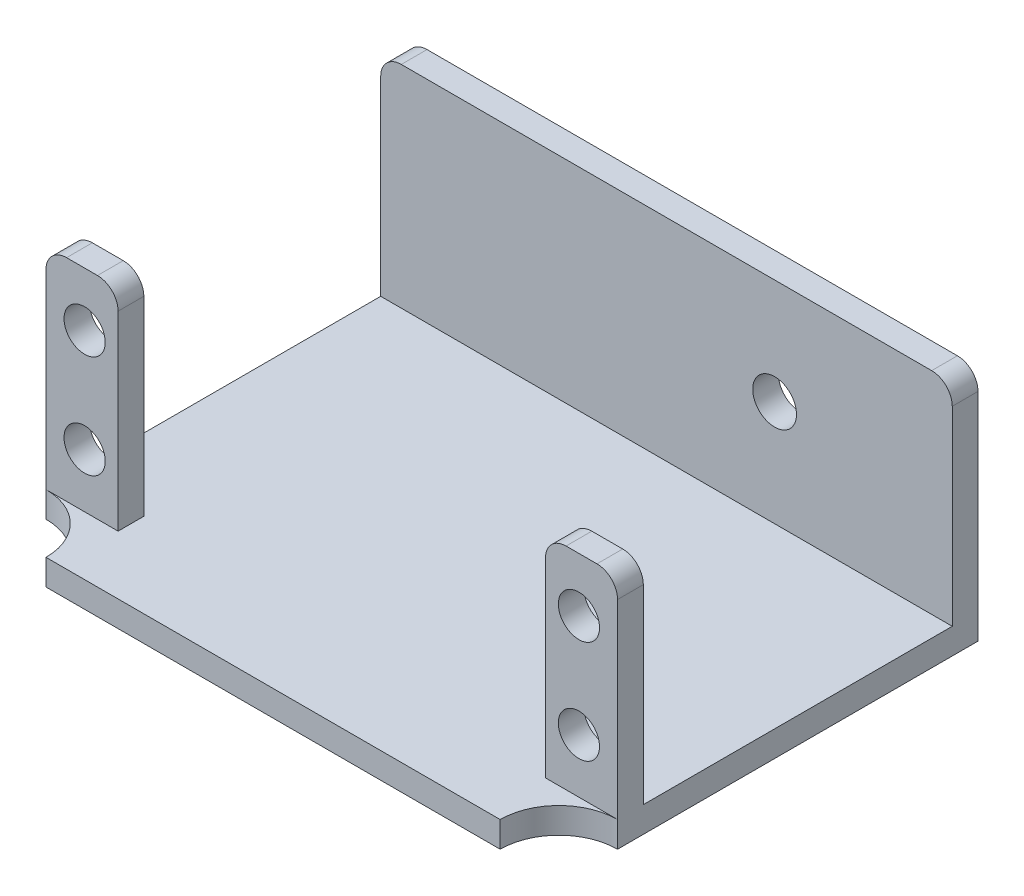
ISO-10303-21;
HEADER;
FILE_DESCRIPTION(('STEP AP214'),'2;1');
FILE_NAME('part.step','',(''),(''),'','','');
FILE_SCHEMA(('AUTOMOTIVE_DESIGN { 1 0 10303 214 1 1 1 1 }'));
ENDSEC;
DATA;
#1=APPLICATION_CONTEXT('core data for automotive mechanical design processes');
#2=APPLICATION_PROTOCOL_DEFINITION('international standard','automotive_design',2000,#1);
#3=PRODUCT_CONTEXT('',#1,'mechanical');
#4=PRODUCT('Part','Part','',(#3));
#5=PRODUCT_RELATED_PRODUCT_CATEGORY('part','',(#4));
#6=PRODUCT_DEFINITION_FORMATION('','',#4);
#7=PRODUCT_DEFINITION_CONTEXT('part definition',#1,'design');
#8=PRODUCT_DEFINITION('design','',#6,#7);
#9=PRODUCT_DEFINITION_SHAPE('','',#8);
#10=(LENGTH_UNIT() NAMED_UNIT(*) SI_UNIT(.MILLI.,.METRE.));
#11=(NAMED_UNIT(*) PLANE_ANGLE_UNIT() SI_UNIT($,.RADIAN.));
#12=(NAMED_UNIT(*) SI_UNIT($,.STERADIAN.) SOLID_ANGLE_UNIT());
#13=UNCERTAINTY_MEASURE_WITH_UNIT(LENGTH_MEASURE(1.E-05),#10,'distance_accuracy_value','');
#14=(GEOMETRIC_REPRESENTATION_CONTEXT(3) GLOBAL_UNCERTAINTY_ASSIGNED_CONTEXT((#13)) GLOBAL_UNIT_ASSIGNED_CONTEXT((#10,
#11,#12)) REPRESENTATION_CONTEXT('',''));
#15=CARTESIAN_POINT('',(0.,0.,0.));
#16=DIRECTION('',(0.,0.,1.));
#17=DIRECTION('',(1.,0.,0.));
#18=AXIS2_PLACEMENT_3D('',#15,#16,#17);
#19=CARTESIAN_POINT('',(0.,2.5,0.));
#20=DIRECTION('',(1.,0.,0.));
#21=DIRECTION('',(0.,0.,-1.));
#22=AXIS2_PLACEMENT_3D('',#19,#20,#21);
#23=PLANE('',#22);
#24=DIRECTION('',(0.,-1.,0.));
#25=VECTOR('',#24,1.);
#26=CARTESIAN_POINT('',(0.,2.5,-5.7));
#27=LINE('',#26,#25);
#28=CARTESIAN_POINT('',(0.,21.,-5.7));
#29=VERTEX_POINT('',#28);
#30=CARTESIAN_POINT('',(0.,2.5,-5.7));
#31=VERTEX_POINT('',#30);
#32=EDGE_CURVE('E255',#29,#31,#27,.T.);
#33=ORIENTED_EDGE('',*,*,#32,.F.);
#34=DIRECTION('',(0.,0.,-1.));
#35=VECTOR('',#34,1.);
#36=CARTESIAN_POINT('',(0.,21.,0.));
#37=LINE('',#36,#35);
#38=CARTESIAN_POINT('',(0.,21.,-8.2));
#39=VERTEX_POINT('',#38);
#40=EDGE_CURVE('E361',#29,#39,#37,.T.);
#41=ORIENTED_EDGE('',*,*,#40,.T.);
#42=DIRECTION('',(0.,-1.,0.));
#43=VECTOR('',#42,1.);
#44=CARTESIAN_POINT('',(0.,2.5,-8.2));
#45=LINE('',#44,#43);
#46=CARTESIAN_POINT('',(0.,2.5,-8.2));
#47=VERTEX_POINT('',#46);
#48=EDGE_CURVE('E254',#39,#47,#45,.T.);
#49=ORIENTED_EDGE('',*,*,#48,.T.);
#50=DIRECTION('',(0.,0.,1.));
#51=VECTOR('',#50,1.);
#52=CARTESIAN_POINT('',(0.,2.5,0.));
#53=LINE('',#52,#51);
#54=CARTESIAN_POINT('',(0.,2.5,-38.2));
#55=VERTEX_POINT('',#54);
#56=EDGE_CURVE('E288',#55,#47,#53,.T.);
#57=ORIENTED_EDGE('',*,*,#56,.F.);
#58=DIRECTION('',(0.,-1.,0.));
#59=VECTOR('',#58,1.);
#60=CARTESIAN_POINT('',(0.,78.5562777730834,-38.2));
#61=LINE('',#60,#59);
#62=CARTESIAN_POINT('',(0.,21.,-38.2));
#63=VERTEX_POINT('',#62);
#64=EDGE_CURVE('E402',#63,#55,#61,.T.);
#65=ORIENTED_EDGE('',*,*,#64,.F.);
#66=DIRECTION('',(0.,0.,-1.));
#67=VECTOR('',#66,1.);
#68=CARTESIAN_POINT('',(0.,21.,0.));
#69=LINE('',#68,#67);
#70=CARTESIAN_POINT('',(0.,21.,-40.7));
#71=VERTEX_POINT('',#70);
#72=EDGE_CURVE('E357',#63,#71,#69,.T.);
#73=ORIENTED_EDGE('',*,*,#72,.T.);
#74=DIRECTION('',(0.,-1.,0.));
#75=VECTOR('',#74,1.);
#76=CARTESIAN_POINT('',(0.,78.5562777730834,-40.7));
#77=LINE('',#76,#75);
#78=CARTESIAN_POINT('',(0.,0.,-40.7));
#79=VERTEX_POINT('',#78);
#80=EDGE_CURVE('E399',#71,#79,#77,.T.);
#81=ORIENTED_EDGE('',*,*,#80,.T.);
#82=DIRECTION('',(0.,0.,1.));
#83=VECTOR('',#82,1.);
#84=CARTESIAN_POINT('',(0.,0.,0.));
#85=LINE('',#84,#83);
#86=CARTESIAN_POINT('',(0.,0.,-5.7));
#87=VERTEX_POINT('',#86);
#88=EDGE_CURVE('E287',#79,#87,#85,.T.);
#89=ORIENTED_EDGE('',*,*,#88,.T.);
#90=DIRECTION('',(0.,1.,0.));
#91=VECTOR('',#90,1.);
#92=CARTESIAN_POINT('',(0.,0.,-5.7));
#93=LINE('',#92,#91);
#94=EDGE_CURVE('E482',#87,#31,#93,.T.);
#95=ORIENTED_EDGE('',*,*,#94,.T.);
#96=EDGE_LOOP('',(#33,#41,#49,#57,#65,#73,#81,#89,#95));
#97=FACE_BOUND('',#96,.T.);
#98=ADVANCED_FACE('F41',(#97),#23,.F.);
#99=CARTESIAN_POINT('',(0.,2.5,0.));
#100=DIRECTION('',(0.,0.,-1.));
#101=DIRECTION('',(-1.,0.,0.));
#102=AXIS2_PLACEMENT_3D('',#99,#100,#101);
#103=PLANE('',#102);
#104=DIRECTION('',(1.,0.,0.));
#105=VECTOR('',#104,1.);
#106=CARTESIAN_POINT('',(0.,2.5,0.));
#107=LINE('',#106,#105);
#108=CARTESIAN_POINT('',(5.7,2.5,0.));
#109=VERTEX_POINT('',#108);
#110=CARTESIAN_POINT('',(49.8,2.5,0.));
#111=VERTEX_POINT('',#110);
#112=EDGE_CURVE('E209',#109,#111,#107,.T.);
#113=ORIENTED_EDGE('',*,*,#112,.F.);
#114=DIRECTION('',(0.,1.,0.));
#115=VECTOR('',#114,1.);
#116=CARTESIAN_POINT('',(5.7,0.,0.));
#117=LINE('',#116,#115);
#118=CARTESIAN_POINT('',(5.7,0.,0.));
#119=VERTEX_POINT('',#118);
#120=EDGE_CURVE('E489',#109,#119,#117,.F.);
#121=ORIENTED_EDGE('',*,*,#120,.T.);
#122=DIRECTION('',(1.,0.,0.));
#123=VECTOR('',#122,1.);
#124=CARTESIAN_POINT('',(0.,0.,0.));
#125=LINE('',#124,#123);
#126=CARTESIAN_POINT('',(49.8,0.,0.));
#127=VERTEX_POINT('',#126);
#128=EDGE_CURVE('E307',#119,#127,#125,.T.);
#129=ORIENTED_EDGE('',*,*,#128,.T.);
#130=DIRECTION('',(0.,1.,0.));
#131=VECTOR('',#130,1.);
#132=CARTESIAN_POINT('',(49.8,0.,0.));
#133=LINE('',#132,#131);
#134=EDGE_CURVE('E195',#127,#111,#133,.T.);
#135=ORIENTED_EDGE('',*,*,#134,.T.);
#136=EDGE_LOOP('',(#113,#121,#129,#135));
#137=FACE_BOUND('',#136,.T.);
#138=ADVANCED_FACE('F525',(#137),#103,.F.);
#139=CARTESIAN_POINT('',(55.5,2.5,0.));
#140=DIRECTION('',(-1.,0.,0.));
#141=DIRECTION('',(0.,0.,1.));
#142=AXIS2_PLACEMENT_3D('',#139,#140,#141);
#143=PLANE('',#142);
#144=DIRECTION('',(0.,1.,0.));
#145=VECTOR('',#144,1.);
#146=CARTESIAN_POINT('',(55.5,2.5,-8.2));
#147=LINE('',#146,#145);
#148=CARTESIAN_POINT('',(55.5,2.5,-8.2));
#149=VERTEX_POINT('',#148);
#150=CARTESIAN_POINT('',(55.5,21.,-8.2));
#151=VERTEX_POINT('',#150);
#152=EDGE_CURVE('E242',#149,#151,#147,.T.);
#153=ORIENTED_EDGE('',*,*,#152,.T.);
#154=DIRECTION('',(0.,0.,-1.));
#155=VECTOR('',#154,1.);
#156=CARTESIAN_POINT('',(55.5,21.,0.));
#157=LINE('',#156,#155);
#158=CARTESIAN_POINT('',(55.5,21.,-5.7));
#159=VERTEX_POINT('',#158);
#160=EDGE_CURVE('E226',#151,#159,#157,.F.);
#161=ORIENTED_EDGE('',*,*,#160,.T.);
#162=DIRECTION('',(0.,1.,0.));
#163=VECTOR('',#162,1.);
#164=CARTESIAN_POINT('',(55.5,2.5,-5.7));
#165=LINE('',#164,#163);
#166=CARTESIAN_POINT('',(55.5,2.5,-5.7));
#167=VERTEX_POINT('',#166);
#168=EDGE_CURVE('E216',#167,#159,#165,.T.);
#169=ORIENTED_EDGE('',*,*,#168,.F.);
#170=DIRECTION('',(0.,1.,0.));
#171=VECTOR('',#170,1.);
#172=CARTESIAN_POINT('',(55.5,0.,-5.7));
#173=LINE('',#172,#171);
#174=CARTESIAN_POINT('',(55.5,0.,-5.7));
#175=VERTEX_POINT('',#174);
#176=EDGE_CURVE('E183',#167,#175,#173,.F.);
#177=ORIENTED_EDGE('',*,*,#176,.T.);
#178=DIRECTION('',(0.,0.,-1.));
#179=VECTOR('',#178,1.);
#180=CARTESIAN_POINT('',(55.5,0.,0.));
#181=LINE('',#180,#179);
#182=CARTESIAN_POINT('',(55.5,0.,-40.7));
#183=VERTEX_POINT('',#182);
#184=EDGE_CURVE('E292',#175,#183,#181,.T.);
#185=ORIENTED_EDGE('',*,*,#184,.T.);
#186=DIRECTION('',(0.,-1.,0.));
#187=VECTOR('',#186,1.);
#188=CARTESIAN_POINT('',(55.5,78.5562777730834,-40.7));
#189=LINE('',#188,#187);
#190=CARTESIAN_POINT('',(55.5,21.,-40.7));
#191=VERTEX_POINT('',#190);
#192=EDGE_CURVE('E408',#191,#183,#189,.T.);
#193=ORIENTED_EDGE('',*,*,#192,.F.);
#194=DIRECTION('',(0.,0.,1.));
#195=VECTOR('',#194,1.);
#196=CARTESIAN_POINT('',(55.5,21.,0.));
#197=LINE('',#196,#195);
#198=CARTESIAN_POINT('',(55.5,21.,-38.2));
#199=VERTEX_POINT('',#198);
#200=EDGE_CURVE('E365',#191,#199,#197,.T.);
#201=ORIENTED_EDGE('',*,*,#200,.T.);
#202=DIRECTION('',(0.,-1.,0.));
#203=VECTOR('',#202,1.);
#204=CARTESIAN_POINT('',(55.5,78.5562777730834,-38.2));
#205=LINE('',#204,#203);
#206=CARTESIAN_POINT('',(55.5,2.5,-38.2));
#207=VERTEX_POINT('',#206);
#208=EDGE_CURVE('E412',#199,#207,#205,.T.);
#209=ORIENTED_EDGE('',*,*,#208,.T.);
#210=DIRECTION('',(0.,0.,-1.));
#211=VECTOR('',#210,1.);
#212=CARTESIAN_POINT('',(55.5,2.5,0.));
#213=LINE('',#212,#211);
#214=EDGE_CURVE('E295',#149,#207,#213,.T.);
#215=ORIENTED_EDGE('',*,*,#214,.F.);
#216=EDGE_LOOP('',(#153,#161,#169,#177,#185,#193,#201,#209,#215));
#217=FACE_BOUND('',#216,.T.);
#218=ADVANCED_FACE('F224',(#217),#143,.F.);
#219=CARTESIAN_POINT('',(0.,2.5,0.));
#220=DIRECTION('',(0.,-1.,0.));
#221=DIRECTION('',(0.,0.,-1.));
#222=AXIS2_PLACEMENT_3D('',#219,#220,#221);
#223=PLANE('',#222);
#224=DIRECTION('',(1.,0.,0.));
#225=VECTOR('',#224,1.);
#226=CARTESIAN_POINT('',(0.,2.5,-5.7));
#227=LINE('',#226,#225);
#228=CARTESIAN_POINT('',(7.,2.5,-5.7));
#229=VERTEX_POINT('',#228);
#230=EDGE_CURVE('E258',#31,#229,#227,.T.);
#231=ORIENTED_EDGE('',*,*,#230,.F.);
#232=CARTESIAN_POINT('',(0.,2.5,0.));
#233=DIRECTION('',(0.,1.,0.));
#234=DIRECTION('',(0.,0.,1.));
#235=AXIS2_PLACEMENT_3D('',#232,#233,#234);
#236=CIRCLE('',#235,5.7);
#237=EDGE_CURVE('E485',#109,#31,#236,.T.);
#238=ORIENTED_EDGE('',*,*,#237,.F.);
#239=ORIENTED_EDGE('',*,*,#112,.T.);
#240=CARTESIAN_POINT('',(55.5,2.5,0.));
#241=DIRECTION('',(0.,1.,0.));
#242=DIRECTION('',(0.,0.,1.));
#243=AXIS2_PLACEMENT_3D('',#240,#241,#242);
#244=CIRCLE('',#243,5.7);
#245=EDGE_CURVE('E186',#167,#111,#244,.T.);
#246=ORIENTED_EDGE('',*,*,#245,.F.);
#247=DIRECTION('',(1.,0.,0.));
#248=VECTOR('',#247,1.);
#249=CARTESIAN_POINT('',(55.5,2.5,-5.7));
#250=LINE('',#249,#248);
#251=CARTESIAN_POINT('',(48.5,2.5,-5.7));
#252=VERTEX_POINT('',#251);
#253=EDGE_CURVE('E205',#252,#167,#250,.T.);
#254=ORIENTED_EDGE('',*,*,#253,.F.);
#255=DIRECTION('',(0.,0.,-1.));
#256=VECTOR('',#255,1.);
#257=CARTESIAN_POINT('',(48.5,2.5,-5.7));
#258=LINE('',#257,#256);
#259=CARTESIAN_POINT('',(48.5,2.5,-8.2));
#260=VERTEX_POINT('',#259);
#261=EDGE_CURVE('E221',#252,#260,#258,.T.);
#262=ORIENTED_EDGE('',*,*,#261,.T.);
#263=DIRECTION('',(1.,0.,0.));
#264=VECTOR('',#263,1.);
#265=CARTESIAN_POINT('',(55.5,2.5,-8.2));
#266=LINE('',#265,#264);
#267=EDGE_CURVE('E229',#260,#149,#266,.T.);
#268=ORIENTED_EDGE('',*,*,#267,.T.);
#269=ORIENTED_EDGE('',*,*,#214,.T.);
#270=DIRECTION('',(-1.,0.,0.));
#271=VECTOR('',#270,1.);
#272=CARTESIAN_POINT('',(0.,2.5,-38.2));
#273=LINE('',#272,#271);
#274=EDGE_CURVE('E299',#207,#55,#273,.T.);
#275=ORIENTED_EDGE('',*,*,#274,.T.);
#276=ORIENTED_EDGE('',*,*,#56,.T.);
#277=DIRECTION('',(1.,0.,0.));
#278=VECTOR('',#277,1.);
#279=CARTESIAN_POINT('',(0.,2.5,-8.2));
#280=LINE('',#279,#278);
#281=CARTESIAN_POINT('',(7.,2.5,-8.2));
#282=VERTEX_POINT('',#281);
#283=EDGE_CURVE('E274',#47,#282,#280,.T.);
#284=ORIENTED_EDGE('',*,*,#283,.T.);
#285=DIRECTION('',(0.,0.,-1.));
#286=VECTOR('',#285,1.);
#287=CARTESIAN_POINT('',(7.,2.5,-5.7));
#288=LINE('',#287,#286);
#289=EDGE_CURVE('E271',#229,#282,#288,.T.);
#290=ORIENTED_EDGE('',*,*,#289,.F.);
#291=EDGE_LOOP('',(#231,#238,#239,#246,#254,#262,#268,#269,#275,#276,#284,#290));
#292=FACE_BOUND('',#291,.T.);
#293=ADVANCED_FACE('F203',(#292),#223,.F.);
#294=CARTESIAN_POINT('',(0.,0.,0.));
#295=DIRECTION('',(0.,-1.,0.));
#296=DIRECTION('',(0.,0.,-1.));
#297=AXIS2_PLACEMENT_3D('',#294,#295,#296);
#298=PLANE('',#297);
#299=CARTESIAN_POINT('',(0.,0.,0.));
#300=DIRECTION('',(0.,1.,0.));
#301=DIRECTION('',(0.,0.,1.));
#302=AXIS2_PLACEMENT_3D('',#299,#300,#301);
#303=CIRCLE('',#302,5.7);
#304=EDGE_CURVE('E196',#119,#87,#303,.T.);
#305=ORIENTED_EDGE('',*,*,#304,.T.);
#306=ORIENTED_EDGE('',*,*,#88,.F.);
#307=DIRECTION('',(-1.,0.,0.));
#308=VECTOR('',#307,1.);
#309=CARTESIAN_POINT('',(0.,0.,-40.7));
#310=LINE('',#309,#308);
#311=EDGE_CURVE('E406',#183,#79,#310,.T.);
#312=ORIENTED_EDGE('',*,*,#311,.F.);
#313=ORIENTED_EDGE('',*,*,#184,.F.);
#314=CARTESIAN_POINT('',(55.5,0.,0.));
#315=DIRECTION('',(0.,1.,0.));
#316=DIRECTION('',(0.,0.,1.));
#317=AXIS2_PLACEMENT_3D('',#314,#315,#316);
#318=CIRCLE('',#317,5.7);
#319=EDGE_CURVE('E189',#175,#127,#318,.T.);
#320=ORIENTED_EDGE('',*,*,#319,.T.);
#321=ORIENTED_EDGE('',*,*,#128,.F.);
#322=EDGE_LOOP('',(#305,#306,#312,#313,#320,#321));
#323=FACE_BOUND('',#322,.T.);
#324=ADVANCED_FACE('F555',(#323),#298,.T.);
#325=CARTESIAN_POINT('',(7.,2.5,-5.7));
#326=DIRECTION('',(-1.,0.,0.));
#327=DIRECTION('',(0.,0.,1.));
#328=AXIS2_PLACEMENT_3D('',#325,#326,#327);
#329=PLANE('',#328);
#330=DIRECTION('',(0.,1.,0.));
#331=VECTOR('',#330,1.);
#332=CARTESIAN_POINT('',(7.,2.5,-8.2));
#333=LINE('',#332,#331);
#334=CARTESIAN_POINT('',(7.,21.,-8.2));
#335=VERTEX_POINT('',#334);
#336=EDGE_CURVE('E277',#282,#335,#333,.T.);
#337=ORIENTED_EDGE('',*,*,#336,.T.);
#338=DIRECTION('',(0.,0.,-1.));
#339=VECTOR('',#338,1.);
#340=CARTESIAN_POINT('',(7.,21.,-5.7));
#341=LINE('',#340,#339);
#342=CARTESIAN_POINT('',(7.,21.,-5.7));
#343=VERTEX_POINT('',#342);
#344=EDGE_CURVE('E325',#335,#343,#341,.F.);
#345=ORIENTED_EDGE('',*,*,#344,.T.);
#346=DIRECTION('',(0.,1.,0.));
#347=VECTOR('',#346,1.);
#348=CARTESIAN_POINT('',(7.,2.5,-5.7));
#349=LINE('',#348,#347);
#350=EDGE_CURVE('E263',#229,#343,#349,.T.);
#351=ORIENTED_EDGE('',*,*,#350,.F.);
#352=ORIENTED_EDGE('',*,*,#289,.T.);
#353=EDGE_LOOP('',(#337,#345,#351,#352));
#354=FACE_BOUND('',#353,.T.);
#355=ADVANCED_FACE('F558',(#354),#329,.F.);
#356=CARTESIAN_POINT('',(0.,23.,-5.7));
#357=DIRECTION('',(0.,-1.,0.));
#358=DIRECTION('',(0.,0.,-1.));
#359=AXIS2_PLACEMENT_3D('',#356,#357,#358);
#360=PLANE('',#359);
#361=DIRECTION('',(-1.,0.,0.));
#362=VECTOR('',#361,1.);
#363=CARTESIAN_POINT('',(0.,23.,-5.7));
#364=LINE('',#363,#362);
#365=CARTESIAN_POINT('',(5.,23.,-5.7));
#366=VERTEX_POINT('',#365);
#367=CARTESIAN_POINT('',(2.,23.,-5.7));
#368=VERTEX_POINT('',#367);
#369=EDGE_CURVE('E267',#366,#368,#364,.T.);
#370=ORIENTED_EDGE('',*,*,#369,.F.);
#371=DIRECTION('',(0.,0.,-1.));
#372=VECTOR('',#371,1.);
#373=CARTESIAN_POINT('',(5.,23.,-5.7));
#374=LINE('',#373,#372);
#375=CARTESIAN_POINT('',(5.,23.,-8.2));
#376=VERTEX_POINT('',#375);
#377=EDGE_CURVE('E315',#366,#376,#374,.T.);
#378=ORIENTED_EDGE('',*,*,#377,.T.);
#379=DIRECTION('',(-1.,0.,0.));
#380=VECTOR('',#379,1.);
#381=CARTESIAN_POINT('',(0.,23.,-8.2));
#382=LINE('',#381,#380);
#383=CARTESIAN_POINT('',(2.,23.,-8.2));
#384=VERTEX_POINT('',#383);
#385=EDGE_CURVE('E259',#376,#384,#382,.T.);
#386=ORIENTED_EDGE('',*,*,#385,.T.);
#387=DIRECTION('',(0.,0.,-1.));
#388=VECTOR('',#387,1.);
#389=CARTESIAN_POINT('',(2.,23.,-5.7));
#390=LINE('',#389,#388);
#391=EDGE_CURVE('E303',#384,#368,#390,.F.);
#392=ORIENTED_EDGE('',*,*,#391,.T.);
#393=EDGE_LOOP('',(#370,#378,#386,#392));
#394=FACE_BOUND('',#393,.T.);
#395=ADVANCED_FACE('F459',(#394),#360,.F.);
#396=CARTESIAN_POINT('',(0.,0.,-5.7));
#397=DIRECTION('',(0.,0.,-1.));
#398=DIRECTION('',(-1.,0.,0.));
#399=AXIS2_PLACEMENT_3D('',#396,#397,#398);
#400=PLANE('',#399);
#401=CARTESIAN_POINT('',(3.75,7.75,-5.7));
#402=DIRECTION('',(0.,0.,1.));
#403=DIRECTION('',(-1.,0.,0.));
#404=AXIS2_PLACEMENT_3D('',#401,#402,#403);
#405=CIRCLE('',#404,2.);
#406=CARTESIAN_POINT('',(1.75,7.75,-5.7));
#407=VERTEX_POINT('',#406);
#408=EDGE_CURVE('E427',#407,#407,#405,.T.);
#409=ORIENTED_EDGE('',*,*,#408,.F.);
#410=EDGE_LOOP('',(#409));
#411=FACE_BOUND('',#410,.T.);
#412=CARTESIAN_POINT('',(3.75,17.75,-5.7));
#413=DIRECTION('',(0.,0.,1.));
#414=DIRECTION('',(1.,0.,0.));
#415=AXIS2_PLACEMENT_3D('',#412,#413,#414);
#416=CIRCLE('',#415,2.);
#417=CARTESIAN_POINT('',(5.75,17.75,-5.7));
#418=VERTEX_POINT('',#417);
#419=EDGE_CURVE('E237',#418,#418,#416,.T.);
#420=ORIENTED_EDGE('',*,*,#419,.F.);
#421=EDGE_LOOP('',(#420));
#422=FACE_BOUND('',#421,.T.);
#423=ORIENTED_EDGE('',*,*,#350,.T.);
#424=CARTESIAN_POINT('',(5.,21.,-5.7));
#425=DIRECTION('',(0.,0.,-1.));
#426=DIRECTION('',(-1.,0.,0.));
#427=AXIS2_PLACEMENT_3D('',#424,#425,#426);
#428=CIRCLE('',#427,2.);
#429=EDGE_CURVE('E331',#343,#366,#428,.F.);
#430=ORIENTED_EDGE('',*,*,#429,.T.);
#431=ORIENTED_EDGE('',*,*,#369,.T.);
#432=CARTESIAN_POINT('',(2.,21.,-5.7));
#433=DIRECTION('',(0.,0.,-1.));
#434=DIRECTION('',(-1.,0.,0.));
#435=AXIS2_PLACEMENT_3D('',#432,#433,#434);
#436=CIRCLE('',#435,2.);
#437=EDGE_CURVE('E328',#368,#29,#436,.F.);
#438=ORIENTED_EDGE('',*,*,#437,.T.);
#439=ORIENTED_EDGE('',*,*,#32,.T.);
#440=ORIENTED_EDGE('',*,*,#230,.T.);
#441=EDGE_LOOP('',(#423,#430,#431,#438,#439,#440));
#442=FACE_BOUND('',#441,.T.);
#443=ADVANCED_FACE('F455',(#411,#422,#442),#400,.F.);
#444=CARTESIAN_POINT('',(0.,0.,-8.2));
#445=DIRECTION('',(0.,0.,-1.));
#446=DIRECTION('',(-1.,0.,0.));
#447=AXIS2_PLACEMENT_3D('',#444,#445,#446);
#448=PLANE('',#447);
#449=CARTESIAN_POINT('',(3.75,7.75,-8.2));
#450=DIRECTION('',(0.,0.,1.));
#451=DIRECTION('',(-1.,0.,0.));
#452=AXIS2_PLACEMENT_3D('',#449,#450,#451);
#453=CIRCLE('',#452,2.);
#454=CARTESIAN_POINT('',(1.75,7.75,-8.2));
#455=VERTEX_POINT('',#454);
#456=EDGE_CURVE('E423',#455,#455,#453,.T.);
#457=ORIENTED_EDGE('',*,*,#456,.T.);
#458=EDGE_LOOP('',(#457));
#459=FACE_BOUND('',#458,.T.);
#460=CARTESIAN_POINT('',(3.75,17.75,-8.2));
#461=DIRECTION('',(0.,0.,1.));
#462=DIRECTION('',(1.,0.,0.));
#463=AXIS2_PLACEMENT_3D('',#460,#461,#462);
#464=CIRCLE('',#463,2.);
#465=CARTESIAN_POINT('',(5.75,17.75,-8.2));
#466=VERTEX_POINT('',#465);
#467=EDGE_CURVE('E246',#466,#466,#464,.T.);
#468=ORIENTED_EDGE('',*,*,#467,.T.);
#469=EDGE_LOOP('',(#468));
#470=FACE_BOUND('',#469,.T.);
#471=ORIENTED_EDGE('',*,*,#385,.F.);
#472=CARTESIAN_POINT('',(5.,21.,-8.2));
#473=DIRECTION('',(0.,0.,-1.));
#474=DIRECTION('',(-1.,0.,0.));
#475=AXIS2_PLACEMENT_3D('',#472,#473,#474);
#476=CIRCLE('',#475,2.);
#477=EDGE_CURVE('E322',#376,#335,#476,.T.);
#478=ORIENTED_EDGE('',*,*,#477,.T.);
#479=ORIENTED_EDGE('',*,*,#336,.F.);
#480=ORIENTED_EDGE('',*,*,#283,.F.);
#481=ORIENTED_EDGE('',*,*,#48,.F.);
#482=CARTESIAN_POINT('',(2.,21.,-8.2));
#483=DIRECTION('',(0.,0.,-1.));
#484=DIRECTION('',(-1.,0.,0.));
#485=AXIS2_PLACEMENT_3D('',#482,#483,#484);
#486=CIRCLE('',#485,2.);
#487=EDGE_CURVE('E319',#39,#384,#486,.T.);
#488=ORIENTED_EDGE('',*,*,#487,.T.);
#489=EDGE_LOOP('',(#471,#478,#479,#480,#481,#488));
#490=FACE_BOUND('',#489,.T.);
#491=ADVANCED_FACE('F458',(#459,#470,#490),#448,.T.);
#492=CARTESIAN_POINT('',(55.5,23.,-5.7));
#493=DIRECTION('',(0.,-1.,0.));
#494=DIRECTION('',(0.,0.,-1.));
#495=AXIS2_PLACEMENT_3D('',#492,#493,#494);
#496=PLANE('',#495);
#497=DIRECTION('',(-1.,0.,0.));
#498=VECTOR('',#497,1.);
#499=CARTESIAN_POINT('',(55.5,23.,-8.2));
#500=LINE('',#499,#498);
#501=CARTESIAN_POINT('',(53.5,23.,-8.2));
#502=VERTEX_POINT('',#501);
#503=CARTESIAN_POINT('',(50.5,23.,-8.2));
#504=VERTEX_POINT('',#503);
#505=EDGE_CURVE('E245',#502,#504,#500,.T.);
#506=ORIENTED_EDGE('',*,*,#505,.T.);
#507=DIRECTION('',(0.,0.,-1.));
#508=VECTOR('',#507,1.);
#509=CARTESIAN_POINT('',(50.5,23.,-5.7));
#510=LINE('',#509,#508);
#511=CARTESIAN_POINT('',(50.5,23.,-5.7));
#512=VERTEX_POINT('',#511);
#513=EDGE_CURVE('E348',#504,#512,#510,.F.);
#514=ORIENTED_EDGE('',*,*,#513,.T.);
#515=DIRECTION('',(-1.,0.,0.));
#516=VECTOR('',#515,1.);
#517=CARTESIAN_POINT('',(55.5,23.,-5.7));
#518=LINE('',#517,#516);
#519=CARTESIAN_POINT('',(53.5,23.,-5.7));
#520=VERTEX_POINT('',#519);
#521=EDGE_CURVE('E228',#520,#512,#518,.T.);
#522=ORIENTED_EDGE('',*,*,#521,.F.);
#523=DIRECTION('',(0.,0.,-1.));
#524=VECTOR('',#523,1.);
#525=CARTESIAN_POINT('',(53.5,23.,-5.7));
#526=LINE('',#525,#524);
#527=EDGE_CURVE('E344',#520,#502,#526,.T.);
#528=ORIENTED_EDGE('',*,*,#527,.T.);
#529=EDGE_LOOP('',(#506,#514,#522,#528));
#530=FACE_BOUND('',#529,.T.);
#531=ADVANCED_FACE('F651',(#530),#496,.F.);
#532=CARTESIAN_POINT('',(48.5,2.5,-5.7));
#533=DIRECTION('',(1.,0.,0.));
#534=DIRECTION('',(0.,0.,-1.));
#535=AXIS2_PLACEMENT_3D('',#532,#533,#534);
#536=PLANE('',#535);
#537=DIRECTION('',(0.,-1.,0.));
#538=VECTOR('',#537,1.);
#539=CARTESIAN_POINT('',(48.5,2.5,-5.7));
#540=LINE('',#539,#538);
#541=CARTESIAN_POINT('',(48.5,21.,-5.7));
#542=VERTEX_POINT('',#541);
#543=EDGE_CURVE('E219',#542,#252,#540,.T.);
#544=ORIENTED_EDGE('',*,*,#543,.F.);
#545=DIRECTION('',(0.,0.,-1.));
#546=VECTOR('',#545,1.);
#547=CARTESIAN_POINT('',(48.5,21.,-5.7));
#548=LINE('',#547,#546);
#549=CARTESIAN_POINT('',(48.5,21.,-8.2));
#550=VERTEX_POINT('',#549);
#551=EDGE_CURVE('E334',#542,#550,#548,.T.);
#552=ORIENTED_EDGE('',*,*,#551,.T.);
#553=DIRECTION('',(0.,-1.,0.));
#554=VECTOR('',#553,1.);
#555=CARTESIAN_POINT('',(48.5,2.5,-8.2));
#556=LINE('',#555,#554);
#557=EDGE_CURVE('E234',#550,#260,#556,.T.);
#558=ORIENTED_EDGE('',*,*,#557,.T.);
#559=ORIENTED_EDGE('',*,*,#261,.F.);
#560=EDGE_LOOP('',(#544,#552,#558,#559));
#561=FACE_BOUND('',#560,.T.);
#562=ADVANCED_FACE('F660',(#561),#536,.F.);
#563=CARTESIAN_POINT('',(0.,0.,-5.7));
#564=DIRECTION('',(0.,0.,1.));
#565=DIRECTION('',(1.,0.,0.));
#566=AXIS2_PLACEMENT_3D('',#563,#564,#565);
#567=PLANE('',#566);
#568=CARTESIAN_POINT('',(51.75,17.75,-5.7));
#569=DIRECTION('',(0.,0.,1.));
#570=DIRECTION('',(-1.,0.,0.));
#571=AXIS2_PLACEMENT_3D('',#568,#569,#570);
#572=CIRCLE('',#571,2.);
#573=CARTESIAN_POINT('',(49.75,17.75,-5.7));
#574=VERTEX_POINT('',#573);
#575=EDGE_CURVE('E394',#574,#574,#572,.T.);
#576=ORIENTED_EDGE('',*,*,#575,.F.);
#577=EDGE_LOOP('',(#576));
#578=FACE_BOUND('',#577,.T.);
#579=CARTESIAN_POINT('',(51.75,7.75,-5.7));
#580=DIRECTION('',(0.,0.,1.));
#581=DIRECTION('',(1.,0.,0.));
#582=AXIS2_PLACEMENT_3D('',#579,#580,#581);
#583=CIRCLE('',#582,2.);
#584=CARTESIAN_POINT('',(53.75,7.75,-5.7));
#585=VERTEX_POINT('',#584);
#586=EDGE_CURVE('E435',#585,#585,#583,.T.);
#587=ORIENTED_EDGE('',*,*,#586,.F.);
#588=EDGE_LOOP('',(#587));
#589=FACE_BOUND('',#588,.T.);
#590=ORIENTED_EDGE('',*,*,#521,.T.);
#591=CARTESIAN_POINT('',(50.5,21.,-5.7));
#592=DIRECTION('',(0.,0.,1.));
#593=DIRECTION('',(1.,0.,0.));
#594=AXIS2_PLACEMENT_3D('',#591,#592,#593);
#595=CIRCLE('',#594,2.);
#596=EDGE_CURVE('E354',#512,#542,#595,.T.);
#597=ORIENTED_EDGE('',*,*,#596,.T.);
#598=ORIENTED_EDGE('',*,*,#543,.T.);
#599=ORIENTED_EDGE('',*,*,#253,.T.);
#600=ORIENTED_EDGE('',*,*,#168,.T.);
#601=CARTESIAN_POINT('',(53.5,21.,-5.7));
#602=DIRECTION('',(0.,0.,1.));
#603=DIRECTION('',(1.,0.,0.));
#604=AXIS2_PLACEMENT_3D('',#601,#602,#603);
#605=CIRCLE('',#604,2.);
#606=EDGE_CURVE('E351',#159,#520,#605,.T.);
#607=ORIENTED_EDGE('',*,*,#606,.T.);
#608=EDGE_LOOP('',(#590,#597,#598,#599,#600,#607));
#609=FACE_BOUND('',#608,.T.);
#610=ADVANCED_FACE('F215',(#578,#589,#609),#567,.T.);
#611=CARTESIAN_POINT('',(0.,0.,-8.2));
#612=DIRECTION('',(0.,0.,1.));
#613=DIRECTION('',(1.,0.,0.));
#614=AXIS2_PLACEMENT_3D('',#611,#612,#613);
#615=PLANE('',#614);
#616=CARTESIAN_POINT('',(51.75,17.75,-8.2));
#617=DIRECTION('',(0.,0.,1.));
#618=DIRECTION('',(-1.,0.,0.));
#619=AXIS2_PLACEMENT_3D('',#616,#617,#618);
#620=CIRCLE('',#619,2.);
#621=CARTESIAN_POINT('',(49.75,17.75,-8.2));
#622=VERTEX_POINT('',#621);
#623=EDGE_CURVE('E439',#622,#622,#620,.T.);
#624=ORIENTED_EDGE('',*,*,#623,.T.);
#625=EDGE_LOOP('',(#624));
#626=FACE_BOUND('',#625,.T.);
#627=CARTESIAN_POINT('',(51.75,7.75,-8.2));
#628=DIRECTION('',(0.,0.,1.));
#629=DIRECTION('',(1.,0.,0.));
#630=AXIS2_PLACEMENT_3D('',#627,#628,#629);
#631=CIRCLE('',#630,2.);
#632=CARTESIAN_POINT('',(53.75,7.75,-8.2));
#633=VERTEX_POINT('',#632);
#634=EDGE_CURVE('E431',#633,#633,#631,.T.);
#635=ORIENTED_EDGE('',*,*,#634,.T.);
#636=EDGE_LOOP('',(#635));
#637=FACE_BOUND('',#636,.T.);
#638=ORIENTED_EDGE('',*,*,#557,.F.);
#639=CARTESIAN_POINT('',(50.5,21.,-8.2));
#640=DIRECTION('',(0.,0.,1.));
#641=DIRECTION('',(1.,0.,0.));
#642=AXIS2_PLACEMENT_3D('',#639,#640,#641);
#643=CIRCLE('',#642,2.);
#644=EDGE_CURVE('E341',#550,#504,#643,.F.);
#645=ORIENTED_EDGE('',*,*,#644,.T.);
#646=ORIENTED_EDGE('',*,*,#505,.F.);
#647=CARTESIAN_POINT('',(53.5,21.,-8.2));
#648=DIRECTION('',(0.,0.,1.));
#649=DIRECTION('',(1.,0.,0.));
#650=AXIS2_PLACEMENT_3D('',#647,#648,#649);
#651=CIRCLE('',#650,2.);
#652=EDGE_CURVE('E338',#502,#151,#651,.F.);
#653=ORIENTED_EDGE('',*,*,#652,.T.);
#654=ORIENTED_EDGE('',*,*,#152,.F.);
#655=ORIENTED_EDGE('',*,*,#267,.F.);
#656=EDGE_LOOP('',(#638,#645,#646,#653,#654,#655));
#657=FACE_BOUND('',#656,.T.);
#658=ADVANCED_FACE('F677',(#626,#637,#657),#615,.F.);
#659=CARTESIAN_POINT('',(51.75,7.75,-8.2));
#660=DIRECTION('',(0.,0.,1.));
#661=DIRECTION('',(1.,0.,0.));
#662=AXIS2_PLACEMENT_3D('',#659,#660,#661);
#663=CYLINDRICAL_SURFACE('',#662,2.);
#664=ORIENTED_EDGE('',*,*,#634,.F.);
#665=EDGE_LOOP('',(#664));
#666=FACE_BOUND('',#665,.T.);
#667=ORIENTED_EDGE('',*,*,#586,.T.);
#668=EDGE_LOOP('',(#667));
#669=FACE_BOUND('',#668,.T.);
#670=ADVANCED_FACE('F686',(#666,#669),#663,.F.);
#671=CARTESIAN_POINT('',(51.75,17.75,-8.2));
#672=DIRECTION('',(0.,0.,1.));
#673=DIRECTION('',(1.,0.,0.));
#674=AXIS2_PLACEMENT_3D('',#671,#672,#673);
#675=CYLINDRICAL_SURFACE('',#674,2.);
#676=ORIENTED_EDGE('',*,*,#623,.F.);
#677=EDGE_LOOP('',(#676));
#678=FACE_BOUND('',#677,.T.);
#679=ORIENTED_EDGE('',*,*,#575,.T.);
#680=EDGE_LOOP('',(#679));
#681=FACE_BOUND('',#680,.T.);
#682=ADVANCED_FACE('F696',(#678,#681),#675,.F.);
#683=CARTESIAN_POINT('',(3.75,17.75,-8.2));
#684=DIRECTION('',(0.,0.,1.));
#685=DIRECTION('',(1.,0.,0.));
#686=AXIS2_PLACEMENT_3D('',#683,#684,#685);
#687=CYLINDRICAL_SURFACE('',#686,2.);
#688=ORIENTED_EDGE('',*,*,#467,.F.);
#689=EDGE_LOOP('',(#688));
#690=FACE_BOUND('',#689,.T.);
#691=ORIENTED_EDGE('',*,*,#419,.T.);
#692=EDGE_LOOP('',(#691));
#693=FACE_BOUND('',#692,.T.);
#694=ADVANCED_FACE('F453',(#690,#693),#687,.F.);
#695=CARTESIAN_POINT('',(3.75,7.75,-8.2));
#696=DIRECTION('',(0.,0.,1.));
#697=DIRECTION('',(1.,0.,0.));
#698=AXIS2_PLACEMENT_3D('',#695,#696,#697);
#699=CYLINDRICAL_SURFACE('',#698,2.);
#700=ORIENTED_EDGE('',*,*,#456,.F.);
#701=EDGE_LOOP('',(#700));
#702=FACE_BOUND('',#701,.T.);
#703=ORIENTED_EDGE('',*,*,#408,.T.);
#704=EDGE_LOOP('',(#703));
#705=FACE_BOUND('',#704,.T.);
#706=ADVANCED_FACE('F520',(#702,#705),#699,.F.);
#707=CARTESIAN_POINT('',(0.,78.5562777730834,-40.7));
#708=DIRECTION('',(0.,0.,1.));
#709=DIRECTION('',(1.,0.,0.));
#710=AXIS2_PLACEMENT_3D('',#707,#708,#709);
#711=PLANE('',#710);
#712=CARTESIAN_POINT('',(38.25,12.75,-40.7));
#713=DIRECTION('',(0.,0.,1.));
#714=DIRECTION('',(1.,0.,0.));
#715=AXIS2_PLACEMENT_3D('',#712,#713,#714);
#716=CIRCLE('',#715,2.125);
#717=CARTESIAN_POINT('',(40.375,12.75,-40.7));
#718=VERTEX_POINT('',#717);
#719=EDGE_CURVE('E414',#718,#718,#716,.T.);
#720=ORIENTED_EDGE('',*,*,#719,.T.);
#721=EDGE_LOOP('',(#720));
#722=FACE_BOUND('',#721,.T.);
#723=DIRECTION('',(1.,0.,0.));
#724=VECTOR('',#723,1.);
#725=CARTESIAN_POINT('',(0.,23.,-40.7));
#726=LINE('',#725,#724);
#727=CARTESIAN_POINT('',(2.,23.,-40.7));
#728=VERTEX_POINT('',#727);
#729=CARTESIAN_POINT('',(53.5,23.,-40.7));
#730=VERTEX_POINT('',#729);
#731=EDGE_CURVE('E386',#728,#730,#726,.T.);
#732=ORIENTED_EDGE('',*,*,#731,.T.);
#733=CARTESIAN_POINT('',(53.5,21.,-40.7));
#734=DIRECTION('',(0.,0.,1.));
#735=DIRECTION('',(1.,0.,0.));
#736=AXIS2_PLACEMENT_3D('',#733,#734,#735);
#737=CIRCLE('',#736,2.);
#738=EDGE_CURVE('E11',#730,#191,#737,.F.);
#739=ORIENTED_EDGE('',*,*,#738,.T.);
#740=ORIENTED_EDGE('',*,*,#192,.T.);
#741=ORIENTED_EDGE('',*,*,#311,.T.);
#742=ORIENTED_EDGE('',*,*,#80,.F.);
#743=CARTESIAN_POINT('',(2.,21.,-40.7));
#744=DIRECTION('',(0.,0.,1.));
#745=DIRECTION('',(1.,0.,0.));
#746=AXIS2_PLACEMENT_3D('',#743,#744,#745);
#747=CIRCLE('',#746,2.);
#748=EDGE_CURVE('E50',#71,#728,#747,.F.);
#749=ORIENTED_EDGE('',*,*,#748,.T.);
#750=EDGE_LOOP('',(#732,#739,#740,#741,#742,#749));
#751=FACE_BOUND('',#750,.T.);
#752=ADVANCED_FACE('F404',(#722,#751),#711,.F.);
#753=CARTESIAN_POINT('',(0.,78.5562777730834,-38.2));
#754=DIRECTION('',(0.,0.,-1.));
#755=DIRECTION('',(-1.,0.,0.));
#756=AXIS2_PLACEMENT_3D('',#753,#754,#755);
#757=PLANE('',#756);
#758=CARTESIAN_POINT('',(38.25,12.75,-38.2));
#759=DIRECTION('',(0.,0.,1.));
#760=DIRECTION('',(1.,0.,0.));
#761=AXIS2_PLACEMENT_3D('',#758,#759,#760);
#762=CIRCLE('',#761,2.125);
#763=CARTESIAN_POINT('',(40.375,12.75,-38.2));
#764=VERTEX_POINT('',#763);
#765=EDGE_CURVE('E503',#764,#764,#762,.T.);
#766=ORIENTED_EDGE('',*,*,#765,.F.);
#767=EDGE_LOOP('',(#766));
#768=FACE_BOUND('',#767,.T.);
#769=ORIENTED_EDGE('',*,*,#208,.F.);
#770=CARTESIAN_POINT('',(53.5,21.,-38.2));
#771=DIRECTION('',(0.,0.,-1.));
#772=DIRECTION('',(-1.,0.,0.));
#773=AXIS2_PLACEMENT_3D('',#770,#771,#772);
#774=CIRCLE('',#773,2.);
#775=CARTESIAN_POINT('',(53.5,23.,-38.2));
#776=VERTEX_POINT('',#775);
#777=EDGE_CURVE('E374',#199,#776,#774,.F.);
#778=ORIENTED_EDGE('',*,*,#777,.T.);
#779=DIRECTION('',(-1.,0.,0.));
#780=VECTOR('',#779,1.);
#781=CARTESIAN_POINT('',(0.,23.,-38.2));
#782=LINE('',#781,#780);
#783=CARTESIAN_POINT('',(2.,23.,-38.2));
#784=VERTEX_POINT('',#783);
#785=EDGE_CURVE('E385',#776,#784,#782,.T.);
#786=ORIENTED_EDGE('',*,*,#785,.T.);
#787=CARTESIAN_POINT('',(2.,21.,-38.2));
#788=DIRECTION('',(0.,0.,-1.));
#789=DIRECTION('',(-1.,0.,0.));
#790=AXIS2_PLACEMENT_3D('',#787,#788,#789);
#791=CIRCLE('',#790,2.);
#792=EDGE_CURVE('E371',#784,#63,#791,.F.);
#793=ORIENTED_EDGE('',*,*,#792,.T.);
#794=ORIENTED_EDGE('',*,*,#64,.T.);
#795=ORIENTED_EDGE('',*,*,#274,.F.);
#796=EDGE_LOOP('',(#769,#778,#786,#793,#794,#795));
#797=FACE_BOUND('',#796,.T.);
#798=ADVANCED_FACE('F391',(#768,#797),#757,.F.);
#799=CARTESIAN_POINT('',(0.,23.,-5.7));
#800=DIRECTION('',(0.,-1.,0.));
#801=DIRECTION('',(0.,0.,-1.));
#802=AXIS2_PLACEMENT_3D('',#799,#800,#801);
#803=PLANE('',#802);
#804=ORIENTED_EDGE('',*,*,#785,.F.);
#805=DIRECTION('',(0.,0.,1.));
#806=VECTOR('',#805,1.);
#807=CARTESIAN_POINT('',(53.5,23.,-5.7));
#808=LINE('',#807,#806);
#809=EDGE_CURVE('E57',#776,#730,#808,.F.);
#810=ORIENTED_EDGE('',*,*,#809,.T.);
#811=ORIENTED_EDGE('',*,*,#731,.F.);
#812=DIRECTION('',(0.,0.,-1.));
#813=VECTOR('',#812,1.);
#814=CARTESIAN_POINT('',(2.,23.,-5.7));
#815=LINE('',#814,#813);
#816=EDGE_CURVE('E377',#728,#784,#815,.F.);
#817=ORIENTED_EDGE('',*,*,#816,.T.);
#818=EDGE_LOOP('',(#804,#810,#811,#817));
#819=FACE_BOUND('',#818,.T.);
#820=ADVANCED_FACE('F384',(#819),#803,.F.);
#821=CARTESIAN_POINT('',(38.25,12.75,-40.7));
#822=DIRECTION('',(0.,0.,1.));
#823=DIRECTION('',(1.,0.,0.));
#824=AXIS2_PLACEMENT_3D('',#821,#822,#823);
#825=CYLINDRICAL_SURFACE('',#824,2.125);
#826=ORIENTED_EDGE('',*,*,#719,.F.);
#827=EDGE_LOOP('',(#826));
#828=FACE_BOUND('',#827,.T.);
#829=ORIENTED_EDGE('',*,*,#765,.T.);
#830=EDGE_LOOP('',(#829));
#831=FACE_BOUND('',#830,.T.);
#832=ADVANCED_FACE('F511',(#828,#831),#825,.F.);
#833=CARTESIAN_POINT('',(55.5,0.,0.));
#834=DIRECTION('',(0.,1.,0.));
#835=DIRECTION('',(0.,0.,1.));
#836=AXIS2_PLACEMENT_3D('',#833,#834,#835);
#837=CYLINDRICAL_SURFACE('',#836,5.7);
#838=ORIENTED_EDGE('',*,*,#319,.F.);
#839=ORIENTED_EDGE('',*,*,#176,.F.);
#840=ORIENTED_EDGE('',*,*,#245,.T.);
#841=ORIENTED_EDGE('',*,*,#134,.F.);
#842=EDGE_LOOP('',(#838,#839,#840,#841));
#843=FACE_BOUND('',#842,.T.);
#844=ADVANCED_FACE('F185',(#843),#837,.F.);
#845=CARTESIAN_POINT('',(0.,0.,0.));
#846=DIRECTION('',(0.,1.,0.));
#847=DIRECTION('',(0.,0.,1.));
#848=AXIS2_PLACEMENT_3D('',#845,#846,#847);
#849=CYLINDRICAL_SURFACE('',#848,5.7);
#850=ORIENTED_EDGE('',*,*,#304,.F.);
#851=ORIENTED_EDGE('',*,*,#120,.F.);
#852=ORIENTED_EDGE('',*,*,#237,.T.);
#853=ORIENTED_EDGE('',*,*,#94,.F.);
#854=EDGE_LOOP('',(#850,#851,#852,#853));
#855=FACE_BOUND('',#854,.T.);
#856=ADVANCED_FACE('F486',(#855),#849,.F.);
#857=CARTESIAN_POINT('',(5.,21.,-5.7));
#858=DIRECTION('',(0.,0.,-1.));
#859=DIRECTION('',(-1.,0.,0.));
#860=AXIS2_PLACEMENT_3D('',#857,#858,#859);
#861=CYLINDRICAL_SURFACE('',#860,2.);
#862=ORIENTED_EDGE('',*,*,#429,.F.);
#863=ORIENTED_EDGE('',*,*,#344,.F.);
#864=ORIENTED_EDGE('',*,*,#477,.F.);
#865=ORIENTED_EDGE('',*,*,#377,.F.);
#866=EDGE_LOOP('',(#862,#863,#864,#865));
#867=FACE_BOUND('',#866,.T.);
#868=ADVANCED_FACE('F469',(#867),#861,.T.);
#869=CARTESIAN_POINT('',(50.5,21.,-5.7));
#870=DIRECTION('',(0.,0.,-1.));
#871=DIRECTION('',(-1.,0.,0.));
#872=AXIS2_PLACEMENT_3D('',#869,#870,#871);
#873=CYLINDRICAL_SURFACE('',#872,2.);
#874=ORIENTED_EDGE('',*,*,#596,.F.);
#875=ORIENTED_EDGE('',*,*,#513,.F.);
#876=ORIENTED_EDGE('',*,*,#644,.F.);
#877=ORIENTED_EDGE('',*,*,#551,.F.);
#878=EDGE_LOOP('',(#874,#875,#876,#877));
#879=FACE_BOUND('',#878,.T.);
#880=ADVANCED_FACE('F536',(#879),#873,.T.);
#881=CARTESIAN_POINT('',(2.,21.,0.));
#882=DIRECTION('',(0.,0.,-1.));
#883=DIRECTION('',(-1.,0.,0.));
#884=AXIS2_PLACEMENT_3D('',#881,#882,#883);
#885=CYLINDRICAL_SURFACE('',#884,2.);
#886=ORIENTED_EDGE('',*,*,#437,.F.);
#887=ORIENTED_EDGE('',*,*,#391,.F.);
#888=ORIENTED_EDGE('',*,*,#487,.F.);
#889=ORIENTED_EDGE('',*,*,#40,.F.);
#890=EDGE_LOOP('',(#886,#887,#888,#889));
#891=FACE_BOUND('',#890,.T.);
#892=ADVANCED_FACE('F480',(#891),#885,.T.);
#893=CARTESIAN_POINT('',(53.5,21.,-5.7));
#894=DIRECTION('',(0.,0.,-1.));
#895=DIRECTION('',(-1.,0.,0.));
#896=AXIS2_PLACEMENT_3D('',#893,#894,#895);
#897=CYLINDRICAL_SURFACE('',#896,2.);
#898=ORIENTED_EDGE('',*,*,#606,.F.);
#899=ORIENTED_EDGE('',*,*,#160,.F.);
#900=ORIENTED_EDGE('',*,*,#652,.F.);
#901=ORIENTED_EDGE('',*,*,#527,.F.);
#902=EDGE_LOOP('',(#898,#899,#900,#901));
#903=FACE_BOUND('',#902,.T.);
#904=ADVANCED_FACE('F542',(#903),#897,.T.);
#905=CARTESIAN_POINT('',(53.5,21.,0.));
#906=DIRECTION('',(0.,0.,1.));
#907=DIRECTION('',(1.,0.,0.));
#908=AXIS2_PLACEMENT_3D('',#905,#906,#907);
#909=CYLINDRICAL_SURFACE('',#908,2.);
#910=ORIENTED_EDGE('',*,*,#738,.F.);
#911=ORIENTED_EDGE('',*,*,#809,.F.);
#912=ORIENTED_EDGE('',*,*,#777,.F.);
#913=ORIENTED_EDGE('',*,*,#200,.F.);
#914=EDGE_LOOP('',(#910,#911,#912,#913));
#915=FACE_BOUND('',#914,.T.);
#916=ADVANCED_FACE('F544',(#915),#909,.T.);
#917=CARTESIAN_POINT('',(2.,21.,0.));
#918=DIRECTION('',(0.,0.,-1.));
#919=DIRECTION('',(-1.,0.,0.));
#920=AXIS2_PLACEMENT_3D('',#917,#918,#919);
#921=CYLINDRICAL_SURFACE('',#920,2.);
#922=ORIENTED_EDGE('',*,*,#792,.F.);
#923=ORIENTED_EDGE('',*,*,#816,.F.);
#924=ORIENTED_EDGE('',*,*,#748,.F.);
#925=ORIENTED_EDGE('',*,*,#72,.F.);
#926=EDGE_LOOP('',(#922,#923,#924,#925));
#927=FACE_BOUND('',#926,.T.);
#928=ADVANCED_FACE('F43',(#927),#921,.T.);
#929=CLOSED_SHELL('',(#98,#138,#218,#293,#324,#355,#395,#443,#491,#531,#562,#610,#658,#670,#682,
#694,#706,#752,#798,#820,#832,#844,#856,#868,#880,#892,#904,#916,#928));
#930=MANIFOLD_SOLID_BREP('B2',#929);
#931=ADVANCED_BREP_SHAPE_REPRESENTATION('',(#18,#930),#14);
#932=SHAPE_DEFINITION_REPRESENTATION(#9,#931);
ENDSEC;
END-ISO-10303-21;
